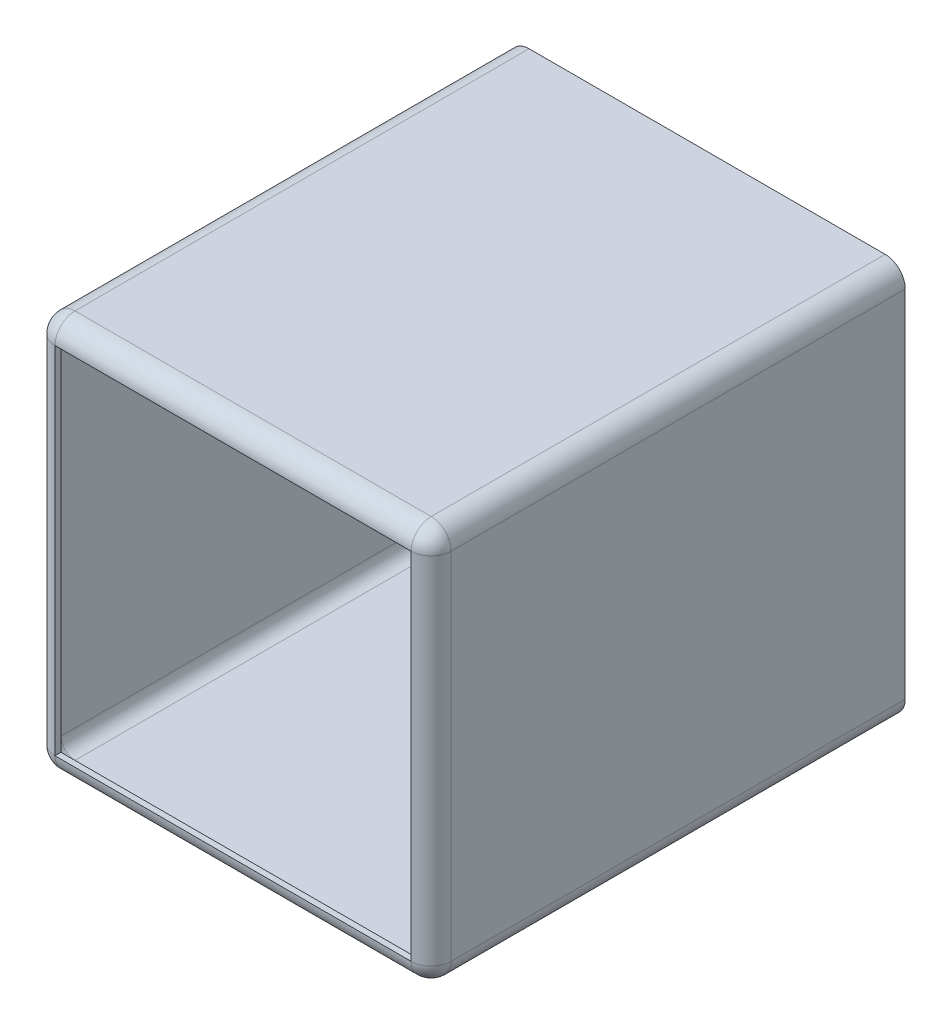
ISO-10303-21;
HEADER;
FILE_DESCRIPTION(('STEP AP214'),'2;1');
FILE_NAME('part.step','',(''),(''),'','','');
FILE_SCHEMA(('AUTOMOTIVE_DESIGN { 1 0 10303 214 1 1 1 1 }'));
ENDSEC;
DATA;
#1=APPLICATION_CONTEXT('core data for automotive mechanical design processes');
#2=APPLICATION_PROTOCOL_DEFINITION('international standard','automotive_design',2000,#1);
#3=PRODUCT_CONTEXT('',#1,'mechanical');
#4=PRODUCT('Part','Part','',(#3));
#5=PRODUCT_RELATED_PRODUCT_CATEGORY('part','',(#4));
#6=PRODUCT_DEFINITION_FORMATION('','',#4);
#7=PRODUCT_DEFINITION_CONTEXT('part definition',#1,'design');
#8=PRODUCT_DEFINITION('design','',#6,#7);
#9=PRODUCT_DEFINITION_SHAPE('','',#8);
#10=(LENGTH_UNIT() NAMED_UNIT(*) SI_UNIT(.MILLI.,.METRE.));
#11=(NAMED_UNIT(*) PLANE_ANGLE_UNIT() SI_UNIT($,.RADIAN.));
#12=(NAMED_UNIT(*) SI_UNIT($,.STERADIAN.) SOLID_ANGLE_UNIT());
#13=UNCERTAINTY_MEASURE_WITH_UNIT(LENGTH_MEASURE(1.E-05),#10,'distance_accuracy_value','');
#14=(GEOMETRIC_REPRESENTATION_CONTEXT(3) GLOBAL_UNCERTAINTY_ASSIGNED_CONTEXT((#13)) GLOBAL_UNIT_ASSIGNED_CONTEXT((#10,
#11,#12)) REPRESENTATION_CONTEXT('',''));
#15=CARTESIAN_POINT('',(0.,0.,0.));
#16=DIRECTION('',(0.,0.,1.));
#17=DIRECTION('',(1.,0.,0.));
#18=AXIS2_PLACEMENT_3D('',#15,#16,#17);
#19=CARTESIAN_POINT('',(89.141925573349,0.0311993062496186,330.));
#20=DIRECTION('',(1.,0.,0.));
#21=DIRECTION('',(0.,1.,0.));
#22=AXIS2_PLACEMENT_3D('',#19,#20,#21);
#23=PLANE('',#22);
#24=DIRECTION('',(0.,1.,0.));
#25=VECTOR('',#24,1.);
#26=CARTESIAN_POINT('',(89.141925573349,0.0311993062496186,330.));
#27=LINE('',#26,#25);
#28=CARTESIAN_POINT('',(89.141925573349,-88.7532362341881,330.));
#29=VERTEX_POINT('',#28);
#30=CARTESIAN_POINT('',(89.141925573349,88.8156348466873,330.));
#31=VERTEX_POINT('',#30);
#32=EDGE_CURVE('E191',#29,#31,#27,.T.);
#33=ORIENTED_EDGE('',*,*,#32,.T.);
#34=DIRECTION('',(0.,0.,-1.));
#35=VECTOR('',#34,1.);
#36=CARTESIAN_POINT('',(89.141925573349,88.8156348466873,330.));
#37=LINE('',#36,#35);
#38=CARTESIAN_POINT('',(89.141925573349,88.8156348466873,327.));
#39=VERTEX_POINT('',#38);
#40=EDGE_CURVE('E371',#39,#31,#37,.F.);
#41=ORIENTED_EDGE('',*,*,#40,.F.);
#42=DIRECTION('',(0.,1.,0.));
#43=VECTOR('',#42,1.);
#44=CARTESIAN_POINT('',(89.141925573349,0.0311993062496186,327.));
#45=LINE('',#44,#43);
#46=CARTESIAN_POINT('',(89.141925573349,-88.7532362341881,327.));
#47=VERTEX_POINT('',#46);
#48=EDGE_CURVE('E366',#47,#39,#45,.T.);
#49=ORIENTED_EDGE('',*,*,#48,.F.);
#50=DIRECTION('',(0.,0.,-1.));
#51=VECTOR('',#50,1.);
#52=CARTESIAN_POINT('',(89.141925573349,-88.7532362341881,330.));
#53=LINE('',#52,#51);
#54=EDGE_CURVE('E224',#47,#29,#53,.F.);
#55=ORIENTED_EDGE('',*,*,#54,.T.);
#56=EDGE_LOOP('',(#33,#41,#49,#55));
#57=FACE_BOUND('',#56,.T.);
#58=ADVANCED_FACE('F40',(#57),#23,.F.);
#59=CARTESIAN_POINT('',(0.128287822008216,88.8156348466873,330.));
#60=DIRECTION('',(0.,1.,0.));
#61=DIRECTION('',(-1.,0.,0.));
#62=AXIS2_PLACEMENT_3D('',#59,#60,#61);
#63=PLANE('',#62);
#64=DIRECTION('',(-1.,0.,0.));
#65=VECTOR('',#64,1.);
#66=CARTESIAN_POINT('',(0.128287822008216,88.8156348466873,330.));
#67=LINE('',#66,#65);
#68=CARTESIAN_POINT('',(-88.8853499293326,88.8156348466873,330.));
#69=VERTEX_POINT('',#68);
#70=EDGE_CURVE('E276',#31,#69,#67,.T.);
#71=ORIENTED_EDGE('',*,*,#70,.T.);
#72=DIRECTION('',(0.,0.,-1.));
#73=VECTOR('',#72,1.);
#74=CARTESIAN_POINT('',(-88.8853499293326,88.8156348466873,330.));
#75=LINE('',#74,#73);
#76=CARTESIAN_POINT('',(-88.8853499293326,88.8156348466873,327.));
#77=VERTEX_POINT('',#76);
#78=EDGE_CURVE('E272',#77,#69,#75,.F.);
#79=ORIENTED_EDGE('',*,*,#78,.F.);
#80=DIRECTION('',(-1.,0.,0.));
#81=VECTOR('',#80,1.);
#82=CARTESIAN_POINT('',(0.128287822008216,88.8156348466873,327.));
#83=LINE('',#82,#81);
#84=EDGE_CURVE('E268',#39,#77,#83,.T.);
#85=ORIENTED_EDGE('',*,*,#84,.F.);
#86=ORIENTED_EDGE('',*,*,#40,.T.);
#87=EDGE_LOOP('',(#71,#79,#85,#86));
#88=FACE_BOUND('',#87,.T.);
#89=ADVANCED_FACE('F583',(#88),#63,.F.);
#90=CARTESIAN_POINT('',(-88.8853499293326,0.031199306249606,330.));
#91=DIRECTION('',(-1.,0.,0.));
#92=DIRECTION('',(0.,-1.,0.));
#93=AXIS2_PLACEMENT_3D('',#90,#91,#92);
#94=PLANE('',#93);
#95=DIRECTION('',(0.,-1.,0.));
#96=VECTOR('',#95,1.);
#97=CARTESIAN_POINT('',(-88.8853499293326,0.031199306249606,330.));
#98=LINE('',#97,#96);
#99=CARTESIAN_POINT('',(-88.8853499293325,-88.7532362341881,330.));
#100=VERTEX_POINT('',#99);
#101=EDGE_CURVE('E215',#69,#100,#98,.T.);
#102=ORIENTED_EDGE('',*,*,#101,.T.);
#103=DIRECTION('',(0.,0.,-1.));
#104=VECTOR('',#103,1.);
#105=CARTESIAN_POINT('',(-88.8853499293325,-88.7532362341881,330.));
#106=LINE('',#105,#104);
#107=CARTESIAN_POINT('',(-88.8853499293325,-88.7532362341881,327.));
#108=VERTEX_POINT('',#107);
#109=EDGE_CURVE('E209',#108,#100,#106,.F.);
#110=ORIENTED_EDGE('',*,*,#109,.F.);
#111=DIRECTION('',(0.,-1.,0.));
#112=VECTOR('',#111,1.);
#113=CARTESIAN_POINT('',(-88.8853499293326,0.03119930624962,327.));
#114=LINE('',#113,#112);
#115=EDGE_CURVE('E212',#77,#108,#114,.T.);
#116=ORIENTED_EDGE('',*,*,#115,.F.);
#117=ORIENTED_EDGE('',*,*,#78,.T.);
#118=EDGE_LOOP('',(#102,#110,#116,#117));
#119=FACE_BOUND('',#118,.T.);
#120=ADVANCED_FACE('F210',(#119),#94,.F.);
#121=CARTESIAN_POINT('',(89.141925573349,0.0311993062496186,320.));
#122=DIRECTION('',(0.,1.,0.));
#123=DIRECTION('',(0.,0.,1.));
#124=AXIS2_PLACEMENT_3D('',#121,#122,#123);
#125=CYLINDRICAL_SURFACE('',#124,10.);
#126=ORIENTED_EDGE('',*,*,#32,.F.);
#127=CARTESIAN_POINT('',(89.141925573349,-88.7532362341881,320.));
#128=DIRECTION('',(0.,1.,0.));
#129=DIRECTION('',(0.,0.,1.));
#130=AXIS2_PLACEMENT_3D('',#127,#128,#129);
#131=CIRCLE('',#130,10.);
#132=CARTESIAN_POINT('',(99.141925573349,-88.7532362341881,320.));
#133=VERTEX_POINT('',#132);
#134=EDGE_CURVE('E447',#29,#133,#131,.T.);
#135=ORIENTED_EDGE('',*,*,#134,.T.);
#136=DIRECTION('',(0.,1.,0.));
#137=VECTOR('',#136,1.);
#138=CARTESIAN_POINT('',(99.141925573349,0.0311993062496186,320.));
#139=LINE('',#138,#137);
#140=CARTESIAN_POINT('',(99.141925573349,88.8156348466873,320.));
#141=VERTEX_POINT('',#140);
#142=EDGE_CURVE('E234',#141,#133,#139,.F.);
#143=ORIENTED_EDGE('',*,*,#142,.F.);
#144=CARTESIAN_POINT('',(89.141925573349,88.8156348466873,320.));
#145=DIRECTION('',(0.,1.,0.));
#146=DIRECTION('',(0.,0.,1.));
#147=AXIS2_PLACEMENT_3D('',#144,#145,#146);
#148=CIRCLE('',#147,10.);
#149=EDGE_CURVE('E444',#141,#31,#148,.F.);
#150=ORIENTED_EDGE('',*,*,#149,.T.);
#151=EDGE_LOOP('',(#126,#135,#143,#150));
#152=FACE_BOUND('',#151,.T.);
#153=ADVANCED_FACE('F588',(#152),#125,.T.);
#154=CARTESIAN_POINT('',(0.128287822008216,88.8156348466873,320.));
#155=DIRECTION('',(-1.,0.,0.));
#156=DIRECTION('',(0.,0.,1.));
#157=AXIS2_PLACEMENT_3D('',#154,#155,#156);
#158=CYLINDRICAL_SURFACE('',#157,10.);
#159=DIRECTION('',(1.,0.,0.));
#160=VECTOR('',#159,1.);
#161=CARTESIAN_POINT('',(0.128287822008216,98.8156348466873,320.));
#162=LINE('',#161,#160);
#163=CARTESIAN_POINT('',(-88.8853499293326,98.8156348466873,320.));
#164=VERTEX_POINT('',#163);
#165=CARTESIAN_POINT('',(89.141925573349,98.8156348466873,320.));
#166=VERTEX_POINT('',#165);
#167=EDGE_CURVE('E240',#164,#166,#162,.T.);
#168=ORIENTED_EDGE('',*,*,#167,.F.);
#169=CARTESIAN_POINT('',(-88.8853499293326,88.8156348466873,320.));
#170=DIRECTION('',(-1.,0.,0.));
#171=DIRECTION('',(0.,0.,1.));
#172=AXIS2_PLACEMENT_3D('',#169,#170,#171);
#173=CIRCLE('',#172,10.);
#174=EDGE_CURVE('E431',#164,#69,#173,.F.);
#175=ORIENTED_EDGE('',*,*,#174,.T.);
#176=ORIENTED_EDGE('',*,*,#70,.F.);
#177=CARTESIAN_POINT('',(89.141925573349,88.8156348466873,320.));
#178=DIRECTION('',(-1.,0.,0.));
#179=DIRECTION('',(0.,0.,1.));
#180=AXIS2_PLACEMENT_3D('',#177,#178,#179);
#181=CIRCLE('',#180,10.);
#182=EDGE_CURVE('E417',#31,#166,#181,.T.);
#183=ORIENTED_EDGE('',*,*,#182,.T.);
#184=EDGE_LOOP('',(#168,#175,#176,#183));
#185=FACE_BOUND('',#184,.T.);
#186=ADVANCED_FACE('F619',(#185),#158,.T.);
#187=CARTESIAN_POINT('',(-88.8853499293326,0.03119930624962,320.));
#188=DIRECTION('',(0.,-1.,0.));
#189=DIRECTION('',(1.,0.,0.));
#190=AXIS2_PLACEMENT_3D('',#187,#188,#189);
#191=CYLINDRICAL_SURFACE('',#190,10.);
#192=ORIENTED_EDGE('',*,*,#101,.F.);
#193=CARTESIAN_POINT('',(-88.8853499293326,88.8156348466873,320.));
#194=DIRECTION('',(0.,-1.,0.));
#195=DIRECTION('',(1.,0.,0.));
#196=AXIS2_PLACEMENT_3D('',#193,#194,#195);
#197=CIRCLE('',#196,10.);
#198=CARTESIAN_POINT('',(-98.8853499293326,88.8156348466873,320.));
#199=VERTEX_POINT('',#198);
#200=EDGE_CURVE('E437',#69,#199,#197,.T.);
#201=ORIENTED_EDGE('',*,*,#200,.T.);
#202=DIRECTION('',(0.,1.,0.));
#203=VECTOR('',#202,1.);
#204=CARTESIAN_POINT('',(-98.8853499293326,0.0311993062496186,320.));
#205=LINE('',#204,#203);
#206=CARTESIAN_POINT('',(-98.8853499293326,-88.7532362341881,320.));
#207=VERTEX_POINT('',#206);
#208=EDGE_CURVE('E291',#207,#199,#205,.T.);
#209=ORIENTED_EDGE('',*,*,#208,.F.);
#210=CARTESIAN_POINT('',(-88.8853499293326,-88.7532362341881,320.));
#211=DIRECTION('',(0.,-1.,0.));
#212=DIRECTION('',(1.,0.,0.));
#213=AXIS2_PLACEMENT_3D('',#210,#211,#212);
#214=CIRCLE('',#213,10.);
#215=EDGE_CURVE('E434',#207,#100,#214,.F.);
#216=ORIENTED_EDGE('',*,*,#215,.T.);
#217=EDGE_LOOP('',(#192,#201,#209,#216));
#218=FACE_BOUND('',#217,.T.);
#219=ADVANCED_FACE('F607',(#218),#191,.T.);
#220=CARTESIAN_POINT('',(0.128287822008216,-88.7532362341881,320.));
#221=DIRECTION('',(1.,0.,0.));
#222=DIRECTION('',(0.,0.,-1.));
#223=AXIS2_PLACEMENT_3D('',#220,#221,#222);
#224=CYLINDRICAL_SURFACE('',#223,10.);
#225=DIRECTION('',(1.,0.,0.));
#226=VECTOR('',#225,1.);
#227=CARTESIAN_POINT('',(0.128287822008216,-88.7532362341881,330.));
#228=LINE('',#227,#226);
#229=EDGE_CURVE('E295',#100,#29,#228,.T.);
#230=ORIENTED_EDGE('',*,*,#229,.F.);
#231=CARTESIAN_POINT('',(-88.8853499293326,-88.7532362341881,320.));
#232=DIRECTION('',(1.,0.,0.));
#233=DIRECTION('',(0.,0.,-1.));
#234=AXIS2_PLACEMENT_3D('',#231,#232,#233);
#235=CIRCLE('',#234,10.);
#236=CARTESIAN_POINT('',(-88.8853499293326,-98.7532362341881,320.));
#237=VERTEX_POINT('',#236);
#238=EDGE_CURVE('E442',#100,#237,#235,.T.);
#239=ORIENTED_EDGE('',*,*,#238,.T.);
#240=DIRECTION('',(1.,0.,0.));
#241=VECTOR('',#240,1.);
#242=CARTESIAN_POINT('',(0.12828782200823,-98.7532362341881,320.));
#243=LINE('',#242,#241);
#244=CARTESIAN_POINT('',(89.141925573349,-98.7532362341881,320.));
#245=VERTEX_POINT('',#244);
#246=EDGE_CURVE('E226',#245,#237,#243,.F.);
#247=ORIENTED_EDGE('',*,*,#246,.F.);
#248=CARTESIAN_POINT('',(89.141925573349,-88.7532362341881,320.));
#249=DIRECTION('',(1.,0.,0.));
#250=DIRECTION('',(0.,0.,-1.));
#251=AXIS2_PLACEMENT_3D('',#248,#249,#250);
#252=CIRCLE('',#251,10.);
#253=EDGE_CURVE('E439',#245,#29,#252,.F.);
#254=ORIENTED_EDGE('',*,*,#253,.T.);
#255=EDGE_LOOP('',(#230,#239,#247,#254));
#256=FACE_BOUND('',#255,.T.);
#257=ADVANCED_FACE('F628',(#256),#224,.T.);
#258=CARTESIAN_POINT('',(0.128287822008216,-88.7532362341881,330.));
#259=DIRECTION('',(0.,-1.,0.));
#260=DIRECTION('',(1.,0.,0.));
#261=AXIS2_PLACEMENT_3D('',#258,#259,#260);
#262=PLANE('',#261);
#263=ORIENTED_EDGE('',*,*,#229,.T.);
#264=ORIENTED_EDGE('',*,*,#54,.F.);
#265=DIRECTION('',(1.,0.,0.));
#266=VECTOR('',#265,1.);
#267=CARTESIAN_POINT('',(0.128287822008216,-88.7532362341881,327.));
#268=LINE('',#267,#266);
#269=EDGE_CURVE('E199',#108,#47,#268,.T.);
#270=ORIENTED_EDGE('',*,*,#269,.F.);
#271=ORIENTED_EDGE('',*,*,#109,.T.);
#272=EDGE_LOOP('',(#263,#264,#270,#271));
#273=FACE_BOUND('',#272,.T.);
#274=ADVANCED_FACE('F222',(#273),#262,.F.);
#275=CARTESIAN_POINT('',(89.141925573349,0.0311993062496186,320.));
#276=DIRECTION('',(0.,1.,0.));
#277=DIRECTION('',(0.,0.,1.));
#278=AXIS2_PLACEMENT_3D('',#275,#276,#277);
#279=CYLINDRICAL_SURFACE('',#278,7.);
#280=DIRECTION('',(0.,1.,0.));
#281=VECTOR('',#280,1.);
#282=CARTESIAN_POINT('',(96.141925573349,0.0311993062496186,320.));
#283=LINE('',#282,#281);
#284=CARTESIAN_POINT('',(96.141925573349,88.8156348466873,320.));
#285=VERTEX_POINT('',#284);
#286=CARTESIAN_POINT('',(96.141925573349,-88.7532362341881,320.));
#287=VERTEX_POINT('',#286);
#288=EDGE_CURVE('E227',#285,#287,#283,.F.);
#289=ORIENTED_EDGE('',*,*,#288,.T.);
#290=CARTESIAN_POINT('',(89.141925573349,-88.7532362341881,320.));
#291=DIRECTION('',(0.,1.,0.));
#292=DIRECTION('',(0.,0.,1.));
#293=AXIS2_PLACEMENT_3D('',#290,#291,#292);
#294=CIRCLE('',#293,7.);
#295=EDGE_CURVE('E390',#287,#47,#294,.F.);
#296=ORIENTED_EDGE('',*,*,#295,.T.);
#297=ORIENTED_EDGE('',*,*,#48,.T.);
#298=CARTESIAN_POINT('',(89.141925573349,88.8156348466873,320.));
#299=DIRECTION('',(0.,1.,0.));
#300=DIRECTION('',(0.,0.,1.));
#301=AXIS2_PLACEMENT_3D('',#298,#299,#300);
#302=CIRCLE('',#301,7.);
#303=EDGE_CURVE('E202',#39,#285,#302,.T.);
#304=ORIENTED_EDGE('',*,*,#303,.T.);
#305=EDGE_LOOP('',(#289,#296,#297,#304));
#306=FACE_BOUND('',#305,.T.);
#307=ADVANCED_FACE('F529',(#306),#279,.F.);
#308=CARTESIAN_POINT('',(0.128287822008216,88.8156348466873,320.));
#309=DIRECTION('',(-1.,0.,0.));
#310=DIRECTION('',(0.,0.,1.));
#311=AXIS2_PLACEMENT_3D('',#308,#309,#310);
#312=CYLINDRICAL_SURFACE('',#311,7.);
#313=ORIENTED_EDGE('',*,*,#84,.T.);
#314=CARTESIAN_POINT('',(-88.8853499293326,88.8156348466873,320.));
#315=DIRECTION('',(-1.,0.,0.));
#316=DIRECTION('',(0.,0.,1.));
#317=AXIS2_PLACEMENT_3D('',#314,#315,#316);
#318=CIRCLE('',#317,7.);
#319=CARTESIAN_POINT('',(-88.8853499293326,95.8156348466873,320.));
#320=VERTEX_POINT('',#319);
#321=EDGE_CURVE('E386',#77,#320,#318,.T.);
#322=ORIENTED_EDGE('',*,*,#321,.T.);
#323=DIRECTION('',(1.,0.,0.));
#324=VECTOR('',#323,1.);
#325=CARTESIAN_POINT('',(0.128287822008216,95.8156348466873,320.));
#326=LINE('',#325,#324);
#327=CARTESIAN_POINT('',(89.141925573349,95.8156348466873,320.));
#328=VERTEX_POINT('',#327);
#329=EDGE_CURVE('E513',#320,#328,#326,.T.);
#330=ORIENTED_EDGE('',*,*,#329,.T.);
#331=CARTESIAN_POINT('',(89.141925573349,88.8156348466873,320.));
#332=DIRECTION('',(-1.,0.,0.));
#333=DIRECTION('',(0.,0.,1.));
#334=AXIS2_PLACEMENT_3D('',#331,#332,#333);
#335=CIRCLE('',#334,7.);
#336=EDGE_CURVE('E383',#328,#39,#335,.F.);
#337=ORIENTED_EDGE('',*,*,#336,.T.);
#338=EDGE_LOOP('',(#313,#322,#330,#337));
#339=FACE_BOUND('',#338,.T.);
#340=ADVANCED_FACE('F579',(#339),#312,.F.);
#341=CARTESIAN_POINT('',(-88.8853499293326,0.03119930624962,320.));
#342=DIRECTION('',(0.,-1.,0.));
#343=DIRECTION('',(1.,0.,0.));
#344=AXIS2_PLACEMENT_3D('',#341,#342,#343);
#345=CYLINDRICAL_SURFACE('',#344,7.);
#346=DIRECTION('',(0.,1.,0.));
#347=VECTOR('',#346,1.);
#348=CARTESIAN_POINT('',(-95.8853499293326,0.031199306249619,320.));
#349=LINE('',#348,#347);
#350=CARTESIAN_POINT('',(-95.8853499293326,-88.7532362341881,320.));
#351=VERTEX_POINT('',#350);
#352=CARTESIAN_POINT('',(-95.8853499293326,88.8156348466873,320.));
#353=VERTEX_POINT('',#352);
#354=EDGE_CURVE('E510',#351,#353,#349,.T.);
#355=ORIENTED_EDGE('',*,*,#354,.T.);
#356=CARTESIAN_POINT('',(-88.8853499293326,88.8156348466873,320.));
#357=DIRECTION('',(0.,-1.,0.));
#358=DIRECTION('',(1.,0.,0.));
#359=AXIS2_PLACEMENT_3D('',#356,#357,#358);
#360=CIRCLE('',#359,7.);
#361=EDGE_CURVE('E190',#353,#77,#360,.F.);
#362=ORIENTED_EDGE('',*,*,#361,.T.);
#363=ORIENTED_EDGE('',*,*,#115,.T.);
#364=CARTESIAN_POINT('',(-88.8853499293326,-88.7532362341881,320.));
#365=DIRECTION('',(0.,-1.,0.));
#366=DIRECTION('',(1.,0.,0.));
#367=AXIS2_PLACEMENT_3D('',#364,#365,#366);
#368=CIRCLE('',#367,7.);
#369=EDGE_CURVE('E180',#108,#351,#368,.T.);
#370=ORIENTED_EDGE('',*,*,#369,.T.);
#371=EDGE_LOOP('',(#355,#362,#363,#370));
#372=FACE_BOUND('',#371,.T.);
#373=ADVANCED_FACE('F230',(#372),#345,.F.);
#374=CARTESIAN_POINT('',(0.128287822008216,-88.7532362341881,320.));
#375=DIRECTION('',(1.,0.,0.));
#376=DIRECTION('',(0.,0.,-1.));
#377=AXIS2_PLACEMENT_3D('',#374,#375,#376);
#378=CYLINDRICAL_SURFACE('',#377,7.);
#379=DIRECTION('',(1.,0.,0.));
#380=VECTOR('',#379,1.);
#381=CARTESIAN_POINT('',(0.12828782200823,-95.7532362341881,320.));
#382=LINE('',#381,#380);
#383=CARTESIAN_POINT('',(89.141925573349,-95.7532362341881,320.));
#384=VERTEX_POINT('',#383);
#385=CARTESIAN_POINT('',(-88.8853499293326,-95.7532362341881,320.));
#386=VERTEX_POINT('',#385);
#387=EDGE_CURVE('E201',#384,#386,#382,.F.);
#388=ORIENTED_EDGE('',*,*,#387,.T.);
#389=CARTESIAN_POINT('',(-88.8853499293326,-88.7532362341881,320.));
#390=DIRECTION('',(1.,0.,0.));
#391=DIRECTION('',(0.,0.,-1.));
#392=AXIS2_PLACEMENT_3D('',#389,#390,#391);
#393=CIRCLE('',#392,7.);
#394=EDGE_CURVE('E183',#386,#108,#393,.F.);
#395=ORIENTED_EDGE('',*,*,#394,.T.);
#396=ORIENTED_EDGE('',*,*,#269,.T.);
#397=CARTESIAN_POINT('',(89.141925573349,-88.7532362341881,320.));
#398=DIRECTION('',(1.,0.,0.));
#399=DIRECTION('',(0.,0.,-1.));
#400=AXIS2_PLACEMENT_3D('',#397,#398,#399);
#401=CIRCLE('',#400,7.);
#402=EDGE_CURVE('E203',#47,#384,#401,.T.);
#403=ORIENTED_EDGE('',*,*,#402,.T.);
#404=EDGE_LOOP('',(#388,#395,#396,#403));
#405=FACE_BOUND('',#404,.T.);
#406=ADVANCED_FACE('F197',(#405),#378,.F.);
#407=CARTESIAN_POINT('',(0.,0.,93.0277563773199));
#408=DIRECTION('',(0.,0.,1.));
#409=DIRECTION('',(1.,0.,0.));
#410=AXIS2_PLACEMENT_3D('',#407,#408,#409);
#411=PLANE('',#410);
#412=DIRECTION('',(0.,1.,0.));
#413=VECTOR('',#412,1.);
#414=CARTESIAN_POINT('',(-98.8853499293326,98.8156348466873,93.0277563773199));
#415=LINE('',#414,#413);
#416=CARTESIAN_POINT('',(-98.8853499293326,-88.7532362341881,93.0277563773199));
#417=VERTEX_POINT('',#416);
#418=CARTESIAN_POINT('',(-98.8853499293326,88.8156348466873,93.0277563773199));
#419=VERTEX_POINT('',#418);
#420=EDGE_CURVE('E500',#417,#419,#415,.T.);
#421=ORIENTED_EDGE('',*,*,#420,.T.);
#422=CARTESIAN_POINT('',(-88.8853499293326,88.8156348466873,93.0277563773199));
#423=DIRECTION('',(0.,0.,1.));
#424=DIRECTION('',(1.,0.,0.));
#425=AXIS2_PLACEMENT_3D('',#422,#423,#424);
#426=CIRCLE('',#425,10.);
#427=CARTESIAN_POINT('',(-88.8853499293325,98.8156348466873,93.0277563773199));
#428=VERTEX_POINT('',#427);
#429=EDGE_CURVE('E462',#419,#428,#426,.F.);
#430=ORIENTED_EDGE('',*,*,#429,.T.);
#431=DIRECTION('',(1.,0.,0.));
#432=VECTOR('',#431,1.);
#433=CARTESIAN_POINT('',(99.141925573349,98.8156348466873,93.0277563773199));
#434=LINE('',#433,#432);
#435=CARTESIAN_POINT('',(89.141925573349,98.8156348466873,93.0277563773199));
#436=VERTEX_POINT('',#435);
#437=EDGE_CURVE('E491',#428,#436,#434,.T.);
#438=ORIENTED_EDGE('',*,*,#437,.T.);
#439=CARTESIAN_POINT('',(89.141925573349,88.8156348466873,93.0277563773199));
#440=DIRECTION('',(0.,0.,1.));
#441=DIRECTION('',(1.,0.,0.));
#442=AXIS2_PLACEMENT_3D('',#439,#440,#441);
#443=CIRCLE('',#442,10.);
#444=CARTESIAN_POINT('',(99.141925573349,88.8156348466873,93.0277563773199));
#445=VERTEX_POINT('',#444);
#446=EDGE_CURVE('E457',#436,#445,#443,.F.);
#447=ORIENTED_EDGE('',*,*,#446,.T.);
#448=DIRECTION('',(0.,-1.,0.));
#449=VECTOR('',#448,1.);
#450=CARTESIAN_POINT('',(99.141925573349,-98.7532362341881,93.0277563773199));
#451=LINE('',#450,#449);
#452=CARTESIAN_POINT('',(99.141925573349,-88.7532362341881,93.0277563773199));
#453=VERTEX_POINT('',#452);
#454=EDGE_CURVE('E499',#445,#453,#451,.T.);
#455=ORIENTED_EDGE('',*,*,#454,.T.);
#456=CARTESIAN_POINT('',(89.141925573349,-88.7532362341881,93.0277563773199));
#457=DIRECTION('',(0.,0.,1.));
#458=DIRECTION('',(1.,0.,0.));
#459=AXIS2_PLACEMENT_3D('',#456,#457,#458);
#460=CIRCLE('',#459,10.);
#461=CARTESIAN_POINT('',(89.141925573349,-98.7532362341881,93.0277563773199));
#462=VERTEX_POINT('',#461);
#463=EDGE_CURVE('E64',#453,#462,#460,.F.);
#464=ORIENTED_EDGE('',*,*,#463,.T.);
#465=DIRECTION('',(-1.,0.,0.));
#466=VECTOR('',#465,1.);
#467=CARTESIAN_POINT('',(-98.8853499293326,-98.7532362341881,93.0277563773199));
#468=LINE('',#467,#466);
#469=CARTESIAN_POINT('',(-88.8853499293326,-98.7532362341881,93.0277563773199));
#470=VERTEX_POINT('',#469);
#471=EDGE_CURVE('E502',#462,#470,#468,.T.);
#472=ORIENTED_EDGE('',*,*,#471,.T.);
#473=CARTESIAN_POINT('',(-88.8853499293326,-88.7532362341881,93.0277563773199));
#474=DIRECTION('',(0.,0.,1.));
#475=DIRECTION('',(1.,0.,0.));
#476=AXIS2_PLACEMENT_3D('',#473,#474,#475);
#477=CIRCLE('',#476,10.);
#478=EDGE_CURVE('E460',#470,#417,#477,.F.);
#479=ORIENTED_EDGE('',*,*,#478,.T.);
#480=EDGE_LOOP('',(#421,#430,#438,#447,#455,#464,#472,#479));
#481=FACE_BOUND('',#480,.T.);
#482=DIRECTION('',(0.,1.,0.));
#483=VECTOR('',#482,1.);
#484=CARTESIAN_POINT('',(-95.8853499293326,-95.7532362341881,93.0277563773199));
#485=LINE('',#484,#483);
#486=CARTESIAN_POINT('',(-95.8853499293326,-88.7532362341881,93.0277563773199));
#487=VERTEX_POINT('',#486);
#488=CARTESIAN_POINT('',(-95.8853499293326,88.8156348466873,93.0277563773199));
#489=VERTEX_POINT('',#488);
#490=EDGE_CURVE('E421',#487,#489,#485,.T.);
#491=ORIENTED_EDGE('',*,*,#490,.F.);
#492=CARTESIAN_POINT('',(-88.8853499293326,-88.7532362341881,93.0277563773199));
#493=DIRECTION('',(0.,0.,1.));
#494=DIRECTION('',(1.,0.,0.));
#495=AXIS2_PLACEMENT_3D('',#492,#493,#494);
#496=CIRCLE('',#495,7.);
#497=CARTESIAN_POINT('',(-88.8853499293326,-95.7532362341881,93.0277563773199));
#498=VERTEX_POINT('',#497);
#499=EDGE_CURVE('E411',#487,#498,#496,.T.);
#500=ORIENTED_EDGE('',*,*,#499,.T.);
#501=DIRECTION('',(-1.,0.,0.));
#502=VECTOR('',#501,1.);
#503=CARTESIAN_POINT('',(96.141925573349,-95.7532362341881,93.0277563773199));
#504=LINE('',#503,#502);
#505=CARTESIAN_POINT('',(89.141925573349,-95.7532362341881,93.0277563773199));
#506=VERTEX_POINT('',#505);
#507=EDGE_CURVE('E504',#506,#498,#504,.T.);
#508=ORIENTED_EDGE('',*,*,#507,.F.);
#509=CARTESIAN_POINT('',(89.141925573349,-88.7532362341881,93.0277563773199));
#510=DIRECTION('',(0.,0.,1.));
#511=DIRECTION('',(1.,0.,0.));
#512=AXIS2_PLACEMENT_3D('',#509,#510,#511);
#513=CIRCLE('',#512,7.);
#514=CARTESIAN_POINT('',(96.141925573349,-88.7532362341881,93.0277563773199));
#515=VERTEX_POINT('',#514);
#516=EDGE_CURVE('E413',#506,#515,#513,.T.);
#517=ORIENTED_EDGE('',*,*,#516,.T.);
#518=DIRECTION('',(0.,-1.,0.));
#519=VECTOR('',#518,1.);
#520=CARTESIAN_POINT('',(96.141925573349,95.8156348466873,93.0277563773199));
#521=LINE('',#520,#519);
#522=CARTESIAN_POINT('',(96.141925573349,88.8156348466873,93.0277563773199));
#523=VERTEX_POINT('',#522);
#524=EDGE_CURVE('E560',#523,#515,#521,.T.);
#525=ORIENTED_EDGE('',*,*,#524,.F.);
#526=CARTESIAN_POINT('',(89.141925573349,88.8156348466873,93.0277563773199));
#527=DIRECTION('',(0.,0.,1.));
#528=DIRECTION('',(1.,0.,0.));
#529=AXIS2_PLACEMENT_3D('',#526,#527,#528);
#530=CIRCLE('',#529,7.);
#531=CARTESIAN_POINT('',(89.141925573349,95.8156348466873,93.0277563773199));
#532=VERTEX_POINT('',#531);
#533=EDGE_CURVE('E415',#523,#532,#530,.T.);
#534=ORIENTED_EDGE('',*,*,#533,.T.);
#535=DIRECTION('',(1.,0.,0.));
#536=VECTOR('',#535,1.);
#537=CARTESIAN_POINT('',(-95.8853499293326,95.8156348466873,93.0277563773199));
#538=LINE('',#537,#536);
#539=CARTESIAN_POINT('',(-88.8853499293326,95.8156348466873,93.0277563773199));
#540=VERTEX_POINT('',#539);
#541=EDGE_CURVE('E557',#540,#532,#538,.T.);
#542=ORIENTED_EDGE('',*,*,#541,.F.);
#543=CARTESIAN_POINT('',(-88.8853499293326,88.8156348466873,93.0277563773199));
#544=DIRECTION('',(0.,0.,1.));
#545=DIRECTION('',(1.,0.,0.));
#546=AXIS2_PLACEMENT_3D('',#543,#544,#545);
#547=CIRCLE('',#546,7.);
#548=EDGE_CURVE('E409',#540,#489,#547,.T.);
#549=ORIENTED_EDGE('',*,*,#548,.T.);
#550=EDGE_LOOP('',(#491,#500,#508,#517,#525,#534,#542,#549));
#551=FACE_BOUND('',#550,.T.);
#552=ADVANCED_FACE('F495',(#481,#551),#411,.F.);
#553=CARTESIAN_POINT('',(-98.8853499293326,98.8156348466873,93.0277563773199));
#554=DIRECTION('',(1.,0.,0.));
#555=DIRECTION('',(0.,1.,0.));
#556=AXIS2_PLACEMENT_3D('',#553,#554,#555);
#557=PLANE('',#556);
#558=ORIENTED_EDGE('',*,*,#208,.T.);
#559=DIRECTION('',(0.,0.,1.));
#560=VECTOR('',#559,1.);
#561=CARTESIAN_POINT('',(-98.8853499293326,88.8156348466873,93.0277563773199));
#562=LINE('',#561,#560);
#563=EDGE_CURVE('E455',#199,#419,#562,.F.);
#564=ORIENTED_EDGE('',*,*,#563,.T.);
#565=ORIENTED_EDGE('',*,*,#420,.F.);
#566=DIRECTION('',(0.,0.,1.));
#567=VECTOR('',#566,1.);
#568=CARTESIAN_POINT('',(-98.8853499293326,-88.7532362341881,93.0277563773199));
#569=LINE('',#568,#567);
#570=EDGE_CURVE('E453',#417,#207,#569,.T.);
#571=ORIENTED_EDGE('',*,*,#570,.T.);
#572=EDGE_LOOP('',(#558,#564,#565,#571));
#573=FACE_BOUND('',#572,.T.);
#574=ADVANCED_FACE('F610',(#573),#557,.F.);
#575=CARTESIAN_POINT('',(99.141925573349,98.8156348466873,93.0277563773199));
#576=DIRECTION('',(0.,-1.,0.));
#577=DIRECTION('',(0.,0.,-1.));
#578=AXIS2_PLACEMENT_3D('',#575,#576,#577);
#579=PLANE('',#578);
#580=ORIENTED_EDGE('',*,*,#437,.F.);
#581=DIRECTION('',(0.,0.,1.));
#582=VECTOR('',#581,1.);
#583=CARTESIAN_POINT('',(-88.8853499293326,98.8156348466873,93.0277563773199));
#584=LINE('',#583,#582);
#585=EDGE_CURVE('E451',#428,#164,#584,.T.);
#586=ORIENTED_EDGE('',*,*,#585,.T.);
#587=ORIENTED_EDGE('',*,*,#167,.T.);
#588=DIRECTION('',(0.,0.,1.));
#589=VECTOR('',#588,1.);
#590=CARTESIAN_POINT('',(89.141925573349,98.8156348466873,93.0277563773199));
#591=LINE('',#590,#589);
#592=EDGE_CURVE('E449',#166,#436,#591,.F.);
#593=ORIENTED_EDGE('',*,*,#592,.T.);
#594=EDGE_LOOP('',(#580,#586,#587,#593));
#595=FACE_BOUND('',#594,.T.);
#596=ADVANCED_FACE('F490',(#595),#579,.F.);
#597=CARTESIAN_POINT('',(99.141925573349,-98.7532362341881,93.0277563773199));
#598=DIRECTION('',(-1.,0.,0.));
#599=DIRECTION('',(0.,-1.,0.));
#600=AXIS2_PLACEMENT_3D('',#597,#598,#599);
#601=PLANE('',#600);
#602=ORIENTED_EDGE('',*,*,#142,.T.);
#603=DIRECTION('',(0.,0.,1.));
#604=VECTOR('',#603,1.);
#605=CARTESIAN_POINT('',(99.141925573349,-88.7532362341881,93.0277563773199));
#606=LINE('',#605,#604);
#607=EDGE_CURVE('E12',#133,#453,#606,.F.);
#608=ORIENTED_EDGE('',*,*,#607,.T.);
#609=ORIENTED_EDGE('',*,*,#454,.F.);
#610=DIRECTION('',(0.,0.,1.));
#611=VECTOR('',#610,1.);
#612=CARTESIAN_POINT('',(99.141925573349,88.8156348466873,93.0277563773199));
#613=LINE('',#612,#611);
#614=EDGE_CURVE('E49',#445,#141,#613,.T.);
#615=ORIENTED_EDGE('',*,*,#614,.T.);
#616=EDGE_LOOP('',(#602,#608,#609,#615));
#617=FACE_BOUND('',#616,.T.);
#618=ADVANCED_FACE('F764',(#617),#601,.F.);
#619=CARTESIAN_POINT('',(-98.8853499293326,-98.7532362341881,93.0277563773199));
#620=DIRECTION('',(0.,1.,0.));
#621=DIRECTION('',(-1.,0.,0.));
#622=AXIS2_PLACEMENT_3D('',#619,#620,#621);
#623=PLANE('',#622);
#624=ORIENTED_EDGE('',*,*,#246,.T.);
#625=DIRECTION('',(0.,0.,1.));
#626=VECTOR('',#625,1.);
#627=CARTESIAN_POINT('',(-88.8853499293326,-98.7532362341881,93.0277563773199));
#628=LINE('',#627,#626);
#629=EDGE_CURVE('E57',#237,#470,#628,.F.);
#630=ORIENTED_EDGE('',*,*,#629,.T.);
#631=ORIENTED_EDGE('',*,*,#471,.F.);
#632=DIRECTION('',(0.,0.,1.));
#633=VECTOR('',#632,1.);
#634=CARTESIAN_POINT('',(89.141925573349,-98.7532362341881,93.0277563773199));
#635=LINE('',#634,#633);
#636=EDGE_CURVE('E464',#462,#245,#635,.T.);
#637=ORIENTED_EDGE('',*,*,#636,.T.);
#638=EDGE_LOOP('',(#624,#630,#631,#637));
#639=FACE_BOUND('',#638,.T.);
#640=ADVANCED_FACE('F595',(#639),#623,.F.);
#641=CARTESIAN_POINT('',(-95.8853499293326,-95.7532362341881,93.0277563773199));
#642=DIRECTION('',(1.,0.,0.));
#643=DIRECTION('',(0.,1.,0.));
#644=AXIS2_PLACEMENT_3D('',#641,#642,#643);
#645=PLANE('',#644);
#646=ORIENTED_EDGE('',*,*,#490,.T.);
#647=DIRECTION('',(0.,0.,1.));
#648=VECTOR('',#647,1.);
#649=CARTESIAN_POINT('',(-95.8853499293326,88.8156348466873,320.));
#650=LINE('',#649,#648);
#651=EDGE_CURVE('E395',#489,#353,#650,.T.);
#652=ORIENTED_EDGE('',*,*,#651,.T.);
#653=ORIENTED_EDGE('',*,*,#354,.F.);
#654=DIRECTION('',(0.,0.,1.));
#655=VECTOR('',#654,1.);
#656=CARTESIAN_POINT('',(-95.8853499293326,-88.7532362341881,93.0277563773199));
#657=LINE('',#656,#655);
#658=EDGE_CURVE('E393',#351,#487,#657,.F.);
#659=ORIENTED_EDGE('',*,*,#658,.T.);
#660=EDGE_LOOP('',(#646,#652,#653,#659));
#661=FACE_BOUND('',#660,.T.);
#662=ADVANCED_FACE('F553',(#661),#645,.T.);
#663=CARTESIAN_POINT('',(-95.8853499293326,95.8156348466873,93.0277563773199));
#664=DIRECTION('',(0.,-1.,0.));
#665=DIRECTION('',(0.,0.,-1.));
#666=AXIS2_PLACEMENT_3D('',#663,#664,#665);
#667=PLANE('',#666);
#668=ORIENTED_EDGE('',*,*,#329,.F.);
#669=DIRECTION('',(0.,0.,1.));
#670=VECTOR('',#669,1.);
#671=CARTESIAN_POINT('',(-88.8853499293326,95.8156348466873,93.0277563773199));
#672=LINE('',#671,#670);
#673=EDGE_CURVE('E399',#320,#540,#672,.F.);
#674=ORIENTED_EDGE('',*,*,#673,.T.);
#675=ORIENTED_EDGE('',*,*,#541,.T.);
#676=DIRECTION('',(0.,0.,1.));
#677=VECTOR('',#676,1.);
#678=CARTESIAN_POINT('',(89.141925573349,95.8156348466873,320.));
#679=LINE('',#678,#677);
#680=EDGE_CURVE('E397',#532,#328,#679,.T.);
#681=ORIENTED_EDGE('',*,*,#680,.T.);
#682=EDGE_LOOP('',(#668,#674,#675,#681));
#683=FACE_BOUND('',#682,.T.);
#684=ADVANCED_FACE('F572',(#683),#667,.T.);
#685=CARTESIAN_POINT('',(96.141925573349,95.8156348466873,93.0277563773199));
#686=DIRECTION('',(-1.,0.,0.));
#687=DIRECTION('',(0.,-1.,0.));
#688=AXIS2_PLACEMENT_3D('',#685,#686,#687);
#689=PLANE('',#688);
#690=ORIENTED_EDGE('',*,*,#524,.T.);
#691=DIRECTION('',(0.,0.,1.));
#692=VECTOR('',#691,1.);
#693=CARTESIAN_POINT('',(96.141925573349,-88.7532362341881,320.));
#694=LINE('',#693,#692);
#695=EDGE_CURVE('E407',#515,#287,#694,.T.);
#696=ORIENTED_EDGE('',*,*,#695,.T.);
#697=ORIENTED_EDGE('',*,*,#288,.F.);
#698=DIRECTION('',(0.,0.,1.));
#699=VECTOR('',#698,1.);
#700=CARTESIAN_POINT('',(96.141925573349,88.8156348466873,93.0277563773199));
#701=LINE('',#700,#699);
#702=EDGE_CURVE('E405',#285,#523,#701,.F.);
#703=ORIENTED_EDGE('',*,*,#702,.T.);
#704=EDGE_LOOP('',(#690,#696,#697,#703));
#705=FACE_BOUND('',#704,.T.);
#706=ADVANCED_FACE('F565',(#705),#689,.T.);
#707=CARTESIAN_POINT('',(96.141925573349,-95.7532362341881,93.0277563773199));
#708=DIRECTION('',(0.,1.,0.));
#709=DIRECTION('',(0.,0.,1.));
#710=AXIS2_PLACEMENT_3D('',#707,#708,#709);
#711=PLANE('',#710);
#712=ORIENTED_EDGE('',*,*,#507,.T.);
#713=DIRECTION('',(0.,0.,1.));
#714=VECTOR('',#713,1.);
#715=CARTESIAN_POINT('',(-88.8853499293326,-95.7532362341881,320.));
#716=LINE('',#715,#714);
#717=EDGE_CURVE('E403',#498,#386,#716,.T.);
#718=ORIENTED_EDGE('',*,*,#717,.T.);
#719=ORIENTED_EDGE('',*,*,#387,.F.);
#720=DIRECTION('',(0.,0.,1.));
#721=VECTOR('',#720,1.);
#722=CARTESIAN_POINT('',(89.141925573349,-95.7532362341881,93.0277563773199));
#723=LINE('',#722,#721);
#724=EDGE_CURVE('E401',#384,#506,#723,.F.);
#725=ORIENTED_EDGE('',*,*,#724,.T.);
#726=EDGE_LOOP('',(#712,#718,#719,#725));
#727=FACE_BOUND('',#726,.T.);
#728=ADVANCED_FACE('F543',(#727),#711,.T.);
#729=CARTESIAN_POINT('',(-88.8853499293326,88.8156348466873,93.0277563773199));
#730=DIRECTION('',(0.,0.,-1.));
#731=DIRECTION('',(-1.,0.,0.));
#732=AXIS2_PLACEMENT_3D('',#729,#730,#731);
#733=CYLINDRICAL_SURFACE('',#732,7.);
#734=ORIENTED_EDGE('',*,*,#548,.F.);
#735=ORIENTED_EDGE('',*,*,#673,.F.);
#736=CARTESIAN_POINT('',(-88.8853499293326,88.8156348466873,320.));
#737=DIRECTION('',(0.,0.,-1.));
#738=DIRECTION('',(-1.,0.,0.));
#739=AXIS2_PLACEMENT_3D('',#736,#737,#738);
#740=CIRCLE('',#739,7.);
#741=EDGE_CURVE('E418',#353,#320,#740,.T.);
#742=ORIENTED_EDGE('',*,*,#741,.F.);
#743=ORIENTED_EDGE('',*,*,#651,.F.);
#744=EDGE_LOOP('',(#734,#735,#742,#743));
#745=FACE_BOUND('',#744,.T.);
#746=ADVANCED_FACE('F575',(#745),#733,.F.);
#747=CARTESIAN_POINT('',(-88.8853499293326,88.8156348466873,320.));
#748=DIRECTION('',(0.,0.,1.));
#749=DIRECTION('',(1.,0.,0.));
#750=AXIS2_PLACEMENT_3D('',#747,#748,#749);
#751=SPHERICAL_SURFACE('',#750,7.);
#752=ORIENTED_EDGE('',*,*,#741,.T.);
#753=ORIENTED_EDGE('',*,*,#321,.F.);
#754=ORIENTED_EDGE('',*,*,#361,.F.);
#755=EDGE_LOOP('',(#752,#753,#754));
#756=FACE_BOUND('',#755,.T.);
#757=ADVANCED_FACE('F578',(#756),#751,.F.);
#758=CARTESIAN_POINT('',(-88.8853499293326,-88.7532362341881,93.0277563773199));
#759=DIRECTION('',(0.,0.,-1.));
#760=DIRECTION('',(-1.,0.,0.));
#761=AXIS2_PLACEMENT_3D('',#758,#759,#760);
#762=CYLINDRICAL_SURFACE('',#761,7.);
#763=ORIENTED_EDGE('',*,*,#499,.F.);
#764=ORIENTED_EDGE('',*,*,#658,.F.);
#765=CARTESIAN_POINT('',(-88.8853499293326,-88.7532362341881,320.));
#766=DIRECTION('',(0.,0.,-1.));
#767=DIRECTION('',(-1.,0.,0.));
#768=AXIS2_PLACEMENT_3D('',#765,#766,#767);
#769=CIRCLE('',#768,7.);
#770=EDGE_CURVE('E185',#386,#351,#769,.T.);
#771=ORIENTED_EDGE('',*,*,#770,.F.);
#772=ORIENTED_EDGE('',*,*,#717,.F.);
#773=EDGE_LOOP('',(#763,#764,#771,#772));
#774=FACE_BOUND('',#773,.T.);
#775=ADVANCED_FACE('F548',(#774),#762,.F.);
#776=CARTESIAN_POINT('',(-88.8853499293326,-88.7532362341881,320.));
#777=DIRECTION('',(0.,0.,1.));
#778=DIRECTION('',(1.,0.,0.));
#779=AXIS2_PLACEMENT_3D('',#776,#777,#778);
#780=SPHERICAL_SURFACE('',#779,7.);
#781=ORIENTED_EDGE('',*,*,#770,.T.);
#782=ORIENTED_EDGE('',*,*,#369,.F.);
#783=ORIENTED_EDGE('',*,*,#394,.F.);
#784=EDGE_LOOP('',(#781,#782,#783));
#785=FACE_BOUND('',#784,.T.);
#786=ADVANCED_FACE('F182',(#785),#780,.F.);
#787=CARTESIAN_POINT('',(89.141925573349,-88.7532362341881,93.0277563773199));
#788=DIRECTION('',(0.,0.,-1.));
#789=DIRECTION('',(-1.,0.,0.));
#790=AXIS2_PLACEMENT_3D('',#787,#788,#789);
#791=CYLINDRICAL_SURFACE('',#790,7.);
#792=ORIENTED_EDGE('',*,*,#516,.F.);
#793=ORIENTED_EDGE('',*,*,#724,.F.);
#794=CARTESIAN_POINT('',(89.141925573349,-88.7532362341881,320.));
#795=DIRECTION('',(0.,0.,-1.));
#796=DIRECTION('',(-1.,0.,0.));
#797=AXIS2_PLACEMENT_3D('',#794,#795,#796);
#798=CIRCLE('',#797,7.);
#799=EDGE_CURVE('E423',#287,#384,#798,.T.);
#800=ORIENTED_EDGE('',*,*,#799,.F.);
#801=ORIENTED_EDGE('',*,*,#695,.F.);
#802=EDGE_LOOP('',(#792,#793,#800,#801));
#803=FACE_BOUND('',#802,.T.);
#804=ADVANCED_FACE('F538',(#803),#791,.F.);
#805=CARTESIAN_POINT('',(89.141925573349,-88.7532362341881,320.));
#806=DIRECTION('',(0.,0.,1.));
#807=DIRECTION('',(1.,0.,0.));
#808=AXIS2_PLACEMENT_3D('',#805,#806,#807);
#809=SPHERICAL_SURFACE('',#808,7.);
#810=ORIENTED_EDGE('',*,*,#799,.T.);
#811=ORIENTED_EDGE('',*,*,#402,.F.);
#812=ORIENTED_EDGE('',*,*,#295,.F.);
#813=EDGE_LOOP('',(#810,#811,#812));
#814=FACE_BOUND('',#813,.T.);
#815=ADVANCED_FACE('F540',(#814),#809,.F.);
#816=CARTESIAN_POINT('',(89.141925573349,88.8156348466873,93.0277563773199));
#817=DIRECTION('',(0.,0.,-1.));
#818=DIRECTION('',(-1.,0.,0.));
#819=AXIS2_PLACEMENT_3D('',#816,#817,#818);
#820=CYLINDRICAL_SURFACE('',#819,7.);
#821=ORIENTED_EDGE('',*,*,#533,.F.);
#822=ORIENTED_EDGE('',*,*,#702,.F.);
#823=CARTESIAN_POINT('',(89.141925573349,88.8156348466873,320.));
#824=DIRECTION('',(0.,0.,-1.));
#825=DIRECTION('',(-1.,0.,0.));
#826=AXIS2_PLACEMENT_3D('',#823,#824,#825);
#827=CIRCLE('',#826,7.);
#828=EDGE_CURVE('E426',#328,#285,#827,.T.);
#829=ORIENTED_EDGE('',*,*,#828,.F.);
#830=ORIENTED_EDGE('',*,*,#680,.F.);
#831=EDGE_LOOP('',(#821,#822,#829,#830));
#832=FACE_BOUND('',#831,.T.);
#833=ADVANCED_FACE('F569',(#832),#820,.F.);
#834=CARTESIAN_POINT('',(89.141925573349,88.8156348466873,320.));
#835=DIRECTION('',(0.,0.,1.));
#836=DIRECTION('',(1.,0.,0.));
#837=AXIS2_PLACEMENT_3D('',#834,#835,#836);
#838=SPHERICAL_SURFACE('',#837,7.);
#839=ORIENTED_EDGE('',*,*,#828,.T.);
#840=ORIENTED_EDGE('',*,*,#303,.F.);
#841=ORIENTED_EDGE('',*,*,#336,.F.);
#842=EDGE_LOOP('',(#839,#840,#841));
#843=FACE_BOUND('',#842,.T.);
#844=ADVANCED_FACE('F652',(#843),#838,.F.);
#845=CARTESIAN_POINT('',(-88.8853499293326,88.8156348466873,93.0277563773199));
#846=DIRECTION('',(0.,0.,1.));
#847=DIRECTION('',(1.,0.,0.));
#848=AXIS2_PLACEMENT_3D('',#845,#846,#847);
#849=CYLINDRICAL_SURFACE('',#848,10.);
#850=ORIENTED_EDGE('',*,*,#429,.F.);
#851=ORIENTED_EDGE('',*,*,#563,.F.);
#852=CARTESIAN_POINT('',(-88.8853499293326,88.8156348466873,320.));
#853=DIRECTION('',(0.,0.,1.));
#854=DIRECTION('',(1.,0.,0.));
#855=AXIS2_PLACEMENT_3D('',#852,#853,#854);
#856=CIRCLE('',#855,10.);
#857=EDGE_CURVE('E429',#164,#199,#856,.T.);
#858=ORIENTED_EDGE('',*,*,#857,.F.);
#859=ORIENTED_EDGE('',*,*,#585,.F.);
#860=EDGE_LOOP('',(#850,#851,#858,#859));
#861=FACE_BOUND('',#860,.T.);
#862=ADVANCED_FACE('F614',(#861),#849,.T.);
#863=CARTESIAN_POINT('',(-88.8853499293326,88.8156348466873,320.));
#864=DIRECTION('',(0.,0.,1.));
#865=DIRECTION('',(1.,0.,0.));
#866=AXIS2_PLACEMENT_3D('',#863,#864,#865);
#867=SPHERICAL_SURFACE('',#866,10.);
#868=ORIENTED_EDGE('',*,*,#857,.T.);
#869=ORIENTED_EDGE('',*,*,#200,.F.);
#870=ORIENTED_EDGE('',*,*,#174,.F.);
#871=EDGE_LOOP('',(#868,#869,#870));
#872=FACE_BOUND('',#871,.T.);
#873=ADVANCED_FACE('F617',(#872),#867,.T.);
#874=CARTESIAN_POINT('',(-88.8853499293326,-88.7532362341881,93.0277563773199));
#875=DIRECTION('',(0.,0.,1.));
#876=DIRECTION('',(1.,0.,0.));
#877=AXIS2_PLACEMENT_3D('',#874,#875,#876);
#878=CYLINDRICAL_SURFACE('',#877,10.);
#879=ORIENTED_EDGE('',*,*,#478,.F.);
#880=ORIENTED_EDGE('',*,*,#629,.F.);
#881=CARTESIAN_POINT('',(-88.8853499293326,-88.7532362341881,320.));
#882=DIRECTION('',(0.,0.,1.));
#883=DIRECTION('',(1.,0.,0.));
#884=AXIS2_PLACEMENT_3D('',#881,#882,#883);
#885=CIRCLE('',#884,10.);
#886=EDGE_CURVE('E470',#207,#237,#885,.T.);
#887=ORIENTED_EDGE('',*,*,#886,.F.);
#888=ORIENTED_EDGE('',*,*,#570,.F.);
#889=EDGE_LOOP('',(#879,#880,#887,#888));
#890=FACE_BOUND('',#889,.T.);
#891=ADVANCED_FACE('F600',(#890),#878,.T.);
#892=CARTESIAN_POINT('',(-88.8853499293326,-88.7532362341881,320.));
#893=DIRECTION('',(0.,0.,1.));
#894=DIRECTION('',(1.,0.,0.));
#895=AXIS2_PLACEMENT_3D('',#892,#893,#894);
#896=SPHERICAL_SURFACE('',#895,10.);
#897=ORIENTED_EDGE('',*,*,#886,.T.);
#898=ORIENTED_EDGE('',*,*,#238,.F.);
#899=ORIENTED_EDGE('',*,*,#215,.F.);
#900=EDGE_LOOP('',(#897,#898,#899));
#901=FACE_BOUND('',#900,.T.);
#902=ADVANCED_FACE('F604',(#901),#896,.T.);
#903=CARTESIAN_POINT('',(89.141925573349,-88.7532362341881,93.0277563773199));
#904=DIRECTION('',(0.,0.,1.));
#905=DIRECTION('',(1.,0.,0.));
#906=AXIS2_PLACEMENT_3D('',#903,#904,#905);
#907=CYLINDRICAL_SURFACE('',#906,10.);
#908=ORIENTED_EDGE('',*,*,#463,.F.);
#909=ORIENTED_EDGE('',*,*,#607,.F.);
#910=CARTESIAN_POINT('',(89.141925573349,-88.7532362341881,320.));
#911=DIRECTION('',(0.,0.,1.));
#912=DIRECTION('',(1.,0.,0.));
#913=AXIS2_PLACEMENT_3D('',#910,#911,#912);
#914=CIRCLE('',#913,10.);
#915=EDGE_CURVE('E472',#245,#133,#914,.T.);
#916=ORIENTED_EDGE('',*,*,#915,.F.);
#917=ORIENTED_EDGE('',*,*,#636,.F.);
#918=EDGE_LOOP('',(#908,#909,#916,#917));
#919=FACE_BOUND('',#918,.T.);
#920=ADVANCED_FACE('F664',(#919),#907,.T.);
#921=CARTESIAN_POINT('',(89.141925573349,-88.7532362341881,320.));
#922=DIRECTION('',(0.,0.,1.));
#923=DIRECTION('',(1.,0.,0.));
#924=AXIS2_PLACEMENT_3D('',#921,#922,#923);
#925=SPHERICAL_SURFACE('',#924,10.);
#926=ORIENTED_EDGE('',*,*,#915,.T.);
#927=ORIENTED_EDGE('',*,*,#134,.F.);
#928=ORIENTED_EDGE('',*,*,#253,.F.);
#929=EDGE_LOOP('',(#926,#927,#928));
#930=FACE_BOUND('',#929,.T.);
#931=ADVANCED_FACE('F667',(#930),#925,.T.);
#932=CARTESIAN_POINT('',(89.141925573349,88.8156348466873,93.0277563773199));
#933=DIRECTION('',(0.,0.,1.));
#934=DIRECTION('',(1.,0.,0.));
#935=AXIS2_PLACEMENT_3D('',#932,#933,#934);
#936=CYLINDRICAL_SURFACE('',#935,10.);
#937=ORIENTED_EDGE('',*,*,#446,.F.);
#938=ORIENTED_EDGE('',*,*,#592,.F.);
#939=CARTESIAN_POINT('',(89.141925573349,88.8156348466873,320.));
#940=DIRECTION('',(0.,0.,1.));
#941=DIRECTION('',(1.,0.,0.));
#942=AXIS2_PLACEMENT_3D('',#939,#940,#941);
#943=CIRCLE('',#942,10.);
#944=EDGE_CURVE('E44',#141,#166,#943,.T.);
#945=ORIENTED_EDGE('',*,*,#944,.F.);
#946=ORIENTED_EDGE('',*,*,#614,.F.);
#947=EDGE_LOOP('',(#937,#938,#945,#946));
#948=FACE_BOUND('',#947,.T.);
#949=ADVANCED_FACE('F42',(#948),#936,.T.);
#950=CARTESIAN_POINT('',(89.141925573349,88.8156348466873,320.));
#951=DIRECTION('',(0.,0.,1.));
#952=DIRECTION('',(1.,0.,0.));
#953=AXIS2_PLACEMENT_3D('',#950,#951,#952);
#954=SPHERICAL_SURFACE('',#953,10.);
#955=ORIENTED_EDGE('',*,*,#944,.T.);
#956=ORIENTED_EDGE('',*,*,#182,.F.);
#957=ORIENTED_EDGE('',*,*,#149,.F.);
#958=EDGE_LOOP('',(#955,#956,#957));
#959=FACE_BOUND('',#958,.T.);
#960=ADVANCED_FACE('F481',(#959),#954,.T.);
#961=CLOSED_SHELL('',(#58,#89,#120,#153,#186,#219,#257,#274,#307,#340,#373,#406,#552,#574,#596,
#618,#640,#662,#684,#706,#728,#746,#757,#775,#786,#804,#815,#833,#844,#862,#873,#891,#902,#920,
#931,#949,#960));
#962=MANIFOLD_SOLID_BREP('B2',#961);
#963=ADVANCED_BREP_SHAPE_REPRESENTATION('',(#18,#962),#14);
#964=SHAPE_DEFINITION_REPRESENTATION(#9,#963);
ENDSEC;
END-ISO-10303-21;
